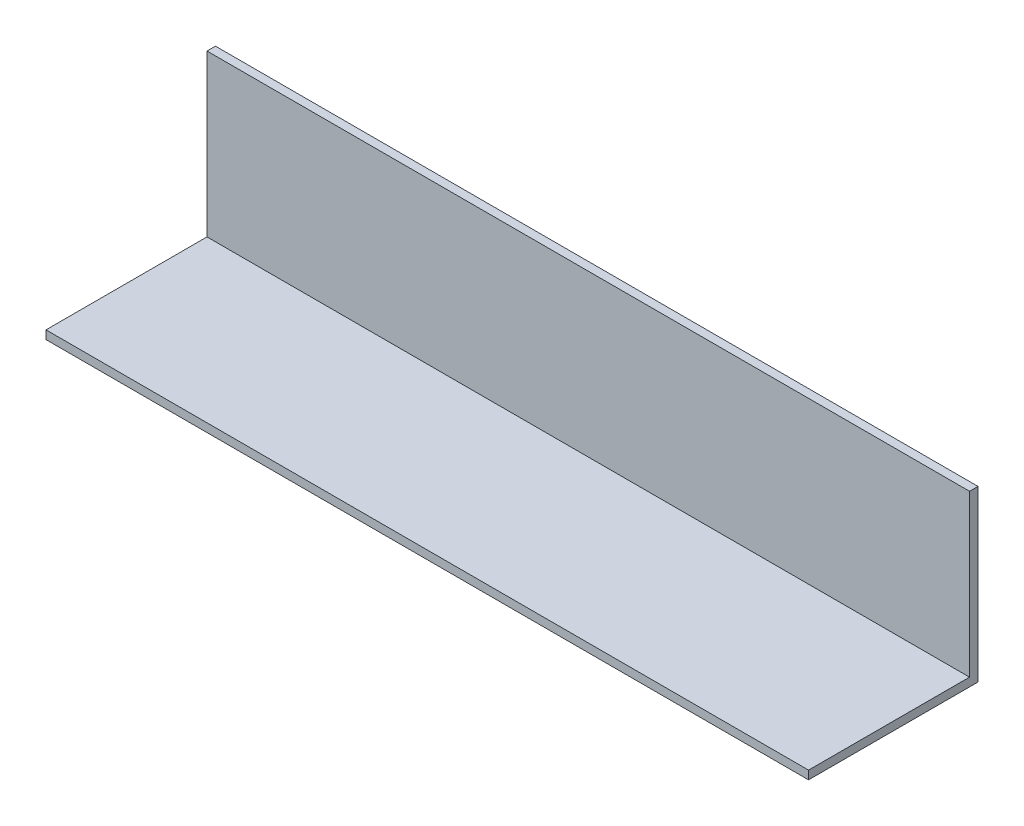
ISO-10303-21;
HEADER;
FILE_DESCRIPTION(('STEP AP214'),'2;1');
FILE_NAME('part.step','',(''),(''),'','','');
FILE_SCHEMA(('AUTOMOTIVE_DESIGN { 1 0 10303 214 1 1 1 1 }'));
ENDSEC;
DATA;
#1=APPLICATION_CONTEXT('core data for automotive mechanical design processes');
#2=APPLICATION_PROTOCOL_DEFINITION('international standard','automotive_design',2000,#1);
#3=PRODUCT_CONTEXT('',#1,'mechanical');
#4=PRODUCT('Part','Part','',(#3));
#5=PRODUCT_RELATED_PRODUCT_CATEGORY('part','',(#4));
#6=PRODUCT_DEFINITION_FORMATION('','',#4);
#7=PRODUCT_DEFINITION_CONTEXT('part definition',#1,'design');
#8=PRODUCT_DEFINITION('design','',#6,#7);
#9=PRODUCT_DEFINITION_SHAPE('','',#8);
#10=(LENGTH_UNIT() NAMED_UNIT(*) SI_UNIT(.MILLI.,.METRE.));
#11=(NAMED_UNIT(*) PLANE_ANGLE_UNIT() SI_UNIT($,.RADIAN.));
#12=(NAMED_UNIT(*) SI_UNIT($,.STERADIAN.) SOLID_ANGLE_UNIT());
#13=UNCERTAINTY_MEASURE_WITH_UNIT(LENGTH_MEASURE(1.E-05),#10,'distance_accuracy_value','');
#14=(GEOMETRIC_REPRESENTATION_CONTEXT(3) GLOBAL_UNCERTAINTY_ASSIGNED_CONTEXT((#13)) GLOBAL_UNIT_ASSIGNED_CONTEXT((#10,
#11,#12)) REPRESENTATION_CONTEXT('',''));
#15=CARTESIAN_POINT('',(0.,0.,0.));
#16=DIRECTION('',(0.,0.,1.));
#17=DIRECTION('',(1.,0.,0.));
#18=AXIS2_PLACEMENT_3D('',#15,#16,#17);
#19=CARTESIAN_POINT('',(228.6,-50.8,5.08));
#20=DIRECTION('',(0.,-1.,0.));
#21=DIRECTION('',(1.,0.,0.));
#22=AXIS2_PLACEMENT_3D('',#19,#20,#21);
#23=PLANE('',#22);
#24=DIRECTION('',(-1.,0.,0.));
#25=VECTOR('',#24,1.);
#26=CARTESIAN_POINT('',(228.6,-50.8,0.));
#27=LINE('',#26,#25);
#28=CARTESIAN_POINT('',(228.6,-50.8,0.));
#29=VERTEX_POINT('',#28);
#30=CARTESIAN_POINT('',(-228.6,-50.8,0.));
#31=VERTEX_POINT('',#30);
#32=EDGE_CURVE('E96',#29,#31,#27,.T.);
#33=ORIENTED_EDGE('',*,*,#32,.F.);
#34=DIRECTION('',(0.,0.,-1.));
#35=VECTOR('',#34,1.);
#36=CARTESIAN_POINT('',(228.6,-50.8,5.08));
#37=LINE('',#36,#35);
#38=CARTESIAN_POINT('',(228.6,-50.8,101.6));
#39=VERTEX_POINT('',#38);
#40=EDGE_CURVE('E11',#39,#29,#37,.T.);
#41=ORIENTED_EDGE('',*,*,#40,.F.);
#42=DIRECTION('',(-1.,0.,0.));
#43=VECTOR('',#42,1.);
#44=CARTESIAN_POINT('',(0.,-50.8,101.6));
#45=LINE('',#44,#43);
#46=CARTESIAN_POINT('',(-228.6,-50.8,101.6));
#47=VERTEX_POINT('',#46);
#48=EDGE_CURVE('E126',#39,#47,#45,.T.);
#49=ORIENTED_EDGE('',*,*,#48,.T.);
#50=DIRECTION('',(0.,0.,-1.));
#51=VECTOR('',#50,1.);
#52=CARTESIAN_POINT('',(-228.6,-50.8,5.08));
#53=LINE('',#52,#51);
#54=EDGE_CURVE('E43',#47,#31,#53,.T.);
#55=ORIENTED_EDGE('',*,*,#54,.T.);
#56=EDGE_LOOP('',(#33,#41,#49,#55));
#57=FACE_BOUND('',#56,.T.);
#58=ADVANCED_FACE('F40',(#57),#23,.T.);
#59=CARTESIAN_POINT('',(228.6,-50.8,5.08));
#60=DIRECTION('',(-1.,0.,0.));
#61=DIRECTION('',(0.,0.,1.));
#62=AXIS2_PLACEMENT_3D('',#59,#60,#61);
#63=PLANE('',#62);
#64=DIRECTION('',(0.,1.,0.));
#65=VECTOR('',#64,1.);
#66=CARTESIAN_POINT('',(228.6,-50.8,5.08));
#67=LINE('',#66,#65);
#68=CARTESIAN_POINT('',(228.6,-45.72,5.08));
#69=VERTEX_POINT('',#68);
#70=CARTESIAN_POINT('',(228.6,50.8,5.08));
#71=VERTEX_POINT('',#70);
#72=EDGE_CURVE('E62',#69,#71,#67,.T.);
#73=ORIENTED_EDGE('',*,*,#72,.F.);
#74=DIRECTION('',(0.,0.,-1.));
#75=VECTOR('',#74,1.);
#76=CARTESIAN_POINT('',(228.6,-45.72,101.6));
#77=LINE('',#76,#75);
#78=CARTESIAN_POINT('',(228.6,-45.72,101.6));
#79=VERTEX_POINT('',#78);
#80=EDGE_CURVE('E122',#79,#69,#77,.T.);
#81=ORIENTED_EDGE('',*,*,#80,.F.);
#82=DIRECTION('',(0.,1.,0.));
#83=VECTOR('',#82,1.);
#84=CARTESIAN_POINT('',(228.6,0.,101.6));
#85=LINE('',#84,#83);
#86=EDGE_CURVE('E87',#39,#79,#85,.T.);
#87=ORIENTED_EDGE('',*,*,#86,.F.);
#88=ORIENTED_EDGE('',*,*,#40,.T.);
#89=DIRECTION('',(0.,1.,0.));
#90=VECTOR('',#89,1.);
#91=CARTESIAN_POINT('',(228.6,-50.8,0.));
#92=LINE('',#91,#90);
#93=CARTESIAN_POINT('',(228.6,50.8,0.));
#94=VERTEX_POINT('',#93);
#95=EDGE_CURVE('E82',#29,#94,#92,.T.);
#96=ORIENTED_EDGE('',*,*,#95,.T.);
#97=DIRECTION('',(0.,0.,-1.));
#98=VECTOR('',#97,1.);
#99=CARTESIAN_POINT('',(228.6,50.8,5.08));
#100=LINE('',#99,#98);
#101=EDGE_CURVE('E48',#71,#94,#100,.T.);
#102=ORIENTED_EDGE('',*,*,#101,.F.);
#103=EDGE_LOOP('',(#73,#81,#87,#88,#96,#102));
#104=FACE_BOUND('',#103,.T.);
#105=ADVANCED_FACE('F81',(#104),#63,.F.);
#106=CARTESIAN_POINT('',(228.6,50.8,5.08));
#107=DIRECTION('',(0.,-1.,0.));
#108=DIRECTION('',(1.,0.,0.));
#109=AXIS2_PLACEMENT_3D('',#106,#107,#108);
#110=PLANE('',#109);
#111=DIRECTION('',(-1.,0.,0.));
#112=VECTOR('',#111,1.);
#113=CARTESIAN_POINT('',(228.6,50.8,0.));
#114=LINE('',#113,#112);
#115=CARTESIAN_POINT('',(-228.6,50.8,0.));
#116=VERTEX_POINT('',#115);
#117=EDGE_CURVE('E98',#94,#116,#114,.T.);
#118=ORIENTED_EDGE('',*,*,#117,.T.);
#119=DIRECTION('',(0.,0.,-1.));
#120=VECTOR('',#119,1.);
#121=CARTESIAN_POINT('',(-228.6,50.8,5.08));
#122=LINE('',#121,#120);
#123=CARTESIAN_POINT('',(-228.6,50.8,5.08));
#124=VERTEX_POINT('',#123);
#125=EDGE_CURVE('E112',#124,#116,#122,.T.);
#126=ORIENTED_EDGE('',*,*,#125,.F.);
#127=DIRECTION('',(-1.,0.,0.));
#128=VECTOR('',#127,1.);
#129=CARTESIAN_POINT('',(228.6,50.8,5.08));
#130=LINE('',#129,#128);
#131=EDGE_CURVE('E116',#71,#124,#130,.T.);
#132=ORIENTED_EDGE('',*,*,#131,.F.);
#133=ORIENTED_EDGE('',*,*,#101,.T.);
#134=EDGE_LOOP('',(#118,#126,#132,#133));
#135=FACE_BOUND('',#134,.T.);
#136=ADVANCED_FACE('F155',(#135),#110,.F.);
#137=CARTESIAN_POINT('',(-228.6,-50.8,5.08));
#138=DIRECTION('',(-1.,0.,0.));
#139=DIRECTION('',(0.,0.,1.));
#140=AXIS2_PLACEMENT_3D('',#137,#138,#139);
#141=PLANE('',#140);
#142=ORIENTED_EDGE('',*,*,#125,.T.);
#143=DIRECTION('',(0.,1.,0.));
#144=VECTOR('',#143,1.);
#145=CARTESIAN_POINT('',(-228.6,-50.8,0.));
#146=LINE('',#145,#144);
#147=EDGE_CURVE('E102',#31,#116,#146,.T.);
#148=ORIENTED_EDGE('',*,*,#147,.F.);
#149=ORIENTED_EDGE('',*,*,#54,.F.);
#150=DIRECTION('',(0.,1.,0.));
#151=VECTOR('',#150,1.);
#152=CARTESIAN_POINT('',(-228.6,0.,101.6));
#153=LINE('',#152,#151);
#154=CARTESIAN_POINT('',(-228.6,-45.72,101.6));
#155=VERTEX_POINT('',#154);
#156=EDGE_CURVE('E128',#47,#155,#153,.T.);
#157=ORIENTED_EDGE('',*,*,#156,.T.);
#158=DIRECTION('',(0.,0.,-1.));
#159=VECTOR('',#158,1.);
#160=CARTESIAN_POINT('',(-228.6,-45.72,101.6));
#161=LINE('',#160,#159);
#162=CARTESIAN_POINT('',(-228.6,-45.72,5.08));
#163=VERTEX_POINT('',#162);
#164=EDGE_CURVE('E106',#155,#163,#161,.T.);
#165=ORIENTED_EDGE('',*,*,#164,.T.);
#166=DIRECTION('',(0.,1.,0.));
#167=VECTOR('',#166,1.);
#168=CARTESIAN_POINT('',(-228.6,-50.8,5.08));
#169=LINE('',#168,#167);
#170=EDGE_CURVE('E56',#163,#124,#169,.T.);
#171=ORIENTED_EDGE('',*,*,#170,.T.);
#172=EDGE_LOOP('',(#142,#148,#149,#157,#165,#171));
#173=FACE_BOUND('',#172,.T.);
#174=ADVANCED_FACE('F145',(#173),#141,.T.);
#175=CARTESIAN_POINT('',(0.,0.,5.08));
#176=DIRECTION('',(0.,0.,-1.));
#177=DIRECTION('',(-1.,0.,0.));
#178=AXIS2_PLACEMENT_3D('',#175,#176,#177);
#179=PLANE('',#178);
#180=ORIENTED_EDGE('',*,*,#170,.F.);
#181=DIRECTION('',(1.,0.,0.));
#182=VECTOR('',#181,1.);
#183=CARTESIAN_POINT('',(0.,-45.72,5.08));
#184=LINE('',#183,#182);
#185=EDGE_CURVE('E103',#163,#69,#184,.T.);
#186=ORIENTED_EDGE('',*,*,#185,.T.);
#187=ORIENTED_EDGE('',*,*,#72,.T.);
#188=ORIENTED_EDGE('',*,*,#131,.T.);
#189=EDGE_LOOP('',(#180,#186,#187,#188));
#190=FACE_BOUND('',#189,.T.);
#191=ADVANCED_FACE('F148',(#190),#179,.F.);
#192=CARTESIAN_POINT('',(0.,0.,0.));
#193=DIRECTION('',(0.,0.,-1.));
#194=DIRECTION('',(-1.,0.,0.));
#195=AXIS2_PLACEMENT_3D('',#192,#193,#194);
#196=PLANE('',#195);
#197=ORIENTED_EDGE('',*,*,#117,.F.);
#198=ORIENTED_EDGE('',*,*,#95,.F.);
#199=ORIENTED_EDGE('',*,*,#32,.T.);
#200=ORIENTED_EDGE('',*,*,#147,.T.);
#201=EDGE_LOOP('',(#197,#198,#199,#200));
#202=FACE_BOUND('',#201,.T.);
#203=ADVANCED_FACE('F95',(#202),#196,.T.);
#204=CARTESIAN_POINT('',(0.,-45.72,101.6));
#205=DIRECTION('',(0.,1.,0.));
#206=DIRECTION('',(0.,0.,1.));
#207=AXIS2_PLACEMENT_3D('',#204,#205,#206);
#208=PLANE('',#207);
#209=ORIENTED_EDGE('',*,*,#185,.F.);
#210=ORIENTED_EDGE('',*,*,#164,.F.);
#211=DIRECTION('',(1.,0.,0.));
#212=VECTOR('',#211,1.);
#213=CARTESIAN_POINT('',(0.,-45.72,101.6));
#214=LINE('',#213,#212);
#215=EDGE_CURVE('E131',#155,#79,#214,.T.);
#216=ORIENTED_EDGE('',*,*,#215,.T.);
#217=ORIENTED_EDGE('',*,*,#80,.T.);
#218=EDGE_LOOP('',(#209,#210,#216,#217));
#219=FACE_BOUND('',#218,.T.);
#220=ADVANCED_FACE('F137',(#219),#208,.T.);
#221=CARTESIAN_POINT('',(0.,0.,101.6));
#222=DIRECTION('',(0.,0.,1.));
#223=DIRECTION('',(1.,0.,0.));
#224=AXIS2_PLACEMENT_3D('',#221,#222,#223);
#225=PLANE('',#224);
#226=ORIENTED_EDGE('',*,*,#215,.F.);
#227=ORIENTED_EDGE('',*,*,#156,.F.);
#228=ORIENTED_EDGE('',*,*,#48,.F.);
#229=ORIENTED_EDGE('',*,*,#86,.T.);
#230=EDGE_LOOP('',(#226,#227,#228,#229));
#231=FACE_BOUND('',#230,.T.);
#232=ADVANCED_FACE('F142',(#231),#225,.T.);
#233=CLOSED_SHELL('',(#58,#105,#136,#174,#191,#203,#220,#232));
#234=MANIFOLD_SOLID_BREP('B2',#233);
#235=ADVANCED_BREP_SHAPE_REPRESENTATION('',(#18,#234),#14);
#236=SHAPE_DEFINITION_REPRESENTATION(#9,#235);
ENDSEC;
END-ISO-10303-21;
